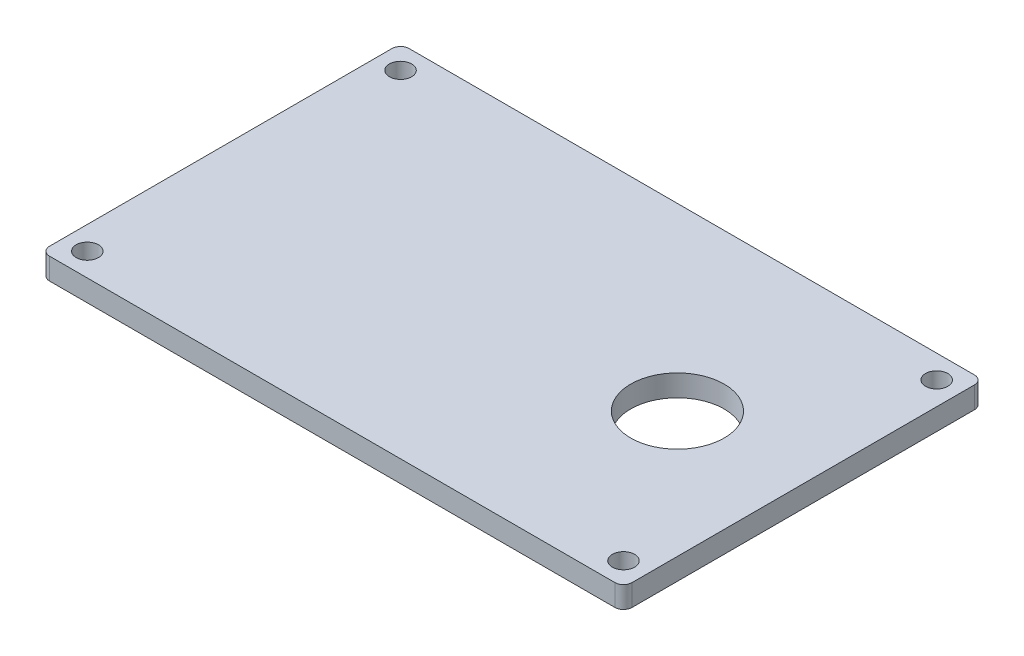
ISO-10303-21;
HEADER;
FILE_DESCRIPTION(('STEP AP214'),'2;1');
FILE_NAME('part.step','',(''),(''),'','','');
FILE_SCHEMA(('AUTOMOTIVE_DESIGN { 1 0 10303 214 1 1 1 1 }'));
ENDSEC;
DATA;
#1=APPLICATION_CONTEXT('core data for automotive mechanical design processes');
#2=APPLICATION_PROTOCOL_DEFINITION('international standard','automotive_design',2000,#1);
#3=PRODUCT_CONTEXT('',#1,'mechanical');
#4=PRODUCT('Part','Part','',(#3));
#5=PRODUCT_RELATED_PRODUCT_CATEGORY('part','',(#4));
#6=PRODUCT_DEFINITION_FORMATION('','',#4);
#7=PRODUCT_DEFINITION_CONTEXT('part definition',#1,'design');
#8=PRODUCT_DEFINITION('design','',#6,#7);
#9=PRODUCT_DEFINITION_SHAPE('','',#8);
#10=(LENGTH_UNIT() NAMED_UNIT(*) SI_UNIT(.MILLI.,.METRE.));
#11=(NAMED_UNIT(*) PLANE_ANGLE_UNIT() SI_UNIT($,.RADIAN.));
#12=(NAMED_UNIT(*) SI_UNIT($,.STERADIAN.) SOLID_ANGLE_UNIT());
#13=UNCERTAINTY_MEASURE_WITH_UNIT(LENGTH_MEASURE(1.E-05),#10,'distance_accuracy_value','');
#14=(GEOMETRIC_REPRESENTATION_CONTEXT(3) GLOBAL_UNCERTAINTY_ASSIGNED_CONTEXT((#13)) GLOBAL_UNIT_ASSIGNED_CONTEXT((#10,
#11,#12)) REPRESENTATION_CONTEXT('',''));
#15=CARTESIAN_POINT('',(0.,0.,0.));
#16=DIRECTION('',(0.,0.,1.));
#17=DIRECTION('',(1.,0.,0.));
#18=AXIS2_PLACEMENT_3D('',#15,#16,#17);
#19=CARTESIAN_POINT('',(-39.3,3.,23.8));
#20=DIRECTION('',(0.,-1.,0.));
#21=DIRECTION('',(0.,0.,-1.));
#22=AXIS2_PLACEMENT_3D('',#19,#20,#21);
#23=PLANE('',#22);
#24=CARTESIAN_POINT('',(23.,3.,0.));
#25=DIRECTION('',(0.,-1.,0.));
#26=DIRECTION('',(0.,0.,-1.));
#27=AXIS2_PLACEMENT_3D('',#24,#25,#26);
#28=CIRCLE('',#27,6.5);
#29=CARTESIAN_POINT('',(23.,3.,-6.5));
#30=VERTEX_POINT('',#29);
#31=EDGE_CURVE('E200',#30,#30,#28,.T.);
#32=ORIENTED_EDGE('',*,*,#31,.T.);
#33=EDGE_LOOP('',(#32));
#34=FACE_BOUND('',#33,.T.);
#35=CARTESIAN_POINT('',(-39.3,3.,23.8));
#36=DIRECTION('',(0.,1.,0.));
#37=DIRECTION('',(0.,0.,-1.));
#38=AXIS2_PLACEMENT_3D('',#35,#36,#37);
#39=CIRCLE('',#38,1.2);
#40=CARTESIAN_POINT('',(-40.5,3.,23.8));
#41=VERTEX_POINT('',#40);
#42=CARTESIAN_POINT('',(-39.3,3.,25.));
#43=VERTEX_POINT('',#42);
#44=EDGE_CURVE('E145',#41,#43,#39,.T.);
#45=ORIENTED_EDGE('',*,*,#44,.T.);
#46=DIRECTION('',(1.,0.,0.));
#47=VECTOR('',#46,1.);
#48=CARTESIAN_POINT('',(-39.3,3.,25.));
#49=LINE('',#48,#47);
#50=CARTESIAN_POINT('',(39.3,3.,25.));
#51=VERTEX_POINT('',#50);
#52=EDGE_CURVE('E93',#43,#51,#49,.T.);
#53=ORIENTED_EDGE('',*,*,#52,.T.);
#54=CARTESIAN_POINT('',(39.3,3.,23.8));
#55=DIRECTION('',(0.,1.,0.));
#56=DIRECTION('',(0.,0.,1.));
#57=AXIS2_PLACEMENT_3D('',#54,#55,#56);
#58=CIRCLE('',#57,1.2);
#59=CARTESIAN_POINT('',(40.5,3.,23.8));
#60=VERTEX_POINT('',#59);
#61=EDGE_CURVE('E160',#51,#60,#58,.T.);
#62=ORIENTED_EDGE('',*,*,#61,.T.);
#63=DIRECTION('',(0.,0.,-1.));
#64=VECTOR('',#63,1.);
#65=CARTESIAN_POINT('',(40.5,3.,23.8));
#66=LINE('',#65,#64);
#67=CARTESIAN_POINT('',(40.5,3.,-23.8));
#68=VERTEX_POINT('',#67);
#69=EDGE_CURVE('E173',#60,#68,#66,.T.);
#70=ORIENTED_EDGE('',*,*,#69,.T.);
#71=CARTESIAN_POINT('',(39.3,3.,-23.8));
#72=DIRECTION('',(0.,1.,0.));
#73=DIRECTION('',(0.,0.,-1.));
#74=AXIS2_PLACEMENT_3D('',#71,#72,#73);
#75=CIRCLE('',#74,1.2);
#76=CARTESIAN_POINT('',(39.3,3.,-25.));
#77=VERTEX_POINT('',#76);
#78=EDGE_CURVE('E112',#68,#77,#75,.T.);
#79=ORIENTED_EDGE('',*,*,#78,.T.);
#80=DIRECTION('',(-1.,0.,0.));
#81=VECTOR('',#80,1.);
#82=CARTESIAN_POINT('',(-39.3,3.,-25.));
#83=LINE('',#82,#81);
#84=CARTESIAN_POINT('',(-39.3,3.,-25.));
#85=VERTEX_POINT('',#84);
#86=EDGE_CURVE('E106',#77,#85,#83,.T.);
#87=ORIENTED_EDGE('',*,*,#86,.T.);
#88=CARTESIAN_POINT('',(-39.3,3.,-23.8));
#89=DIRECTION('',(0.,1.,0.));
#90=DIRECTION('',(0.,0.,-1.));
#91=AXIS2_PLACEMENT_3D('',#88,#89,#90);
#92=CIRCLE('',#91,1.2);
#93=CARTESIAN_POINT('',(-40.5,3.,-23.8));
#94=VERTEX_POINT('',#93);
#95=EDGE_CURVE('E110',#85,#94,#92,.T.);
#96=ORIENTED_EDGE('',*,*,#95,.T.);
#97=DIRECTION('',(0.,0.,1.));
#98=VECTOR('',#97,1.);
#99=CARTESIAN_POINT('',(-40.5,3.,23.8));
#100=LINE('',#99,#98);
#101=EDGE_CURVE('E50',#94,#41,#100,.T.);
#102=ORIENTED_EDGE('',*,*,#101,.T.);
#103=EDGE_LOOP('',(#45,#53,#62,#70,#79,#87,#96,#102));
#104=FACE_BOUND('',#103,.T.);
#105=CARTESIAN_POINT('',(-37.275,3.,-21.775));
#106=DIRECTION('',(0.,1.,0.));
#107=DIRECTION('',(0.,0.,1.));
#108=AXIS2_PLACEMENT_3D('',#105,#106,#107);
#109=CIRCLE('',#108,1.54999999999999);
#110=CARTESIAN_POINT('',(-37.275,3.,-20.225));
#111=VERTEX_POINT('',#110);
#112=EDGE_CURVE('E134',#111,#111,#109,.T.);
#113=ORIENTED_EDGE('',*,*,#112,.F.);
#114=EDGE_LOOP('',(#113));
#115=FACE_BOUND('',#114,.T.);
#116=CARTESIAN_POINT('',(37.275,3.,-21.775));
#117=DIRECTION('',(0.,1.,0.));
#118=DIRECTION('',(0.,0.,1.));
#119=AXIS2_PLACEMENT_3D('',#116,#117,#118);
#120=CIRCLE('',#119,1.54999999999999);
#121=CARTESIAN_POINT('',(37.275,3.,-20.225));
#122=VERTEX_POINT('',#121);
#123=EDGE_CURVE('E182',#122,#122,#120,.T.);
#124=ORIENTED_EDGE('',*,*,#123,.F.);
#125=EDGE_LOOP('',(#124));
#126=FACE_BOUND('',#125,.T.);
#127=CARTESIAN_POINT('',(37.275,3.,21.775));
#128=DIRECTION('',(0.,1.,0.));
#129=DIRECTION('',(0.,0.,1.));
#130=AXIS2_PLACEMENT_3D('',#127,#128,#129);
#131=CIRCLE('',#130,1.54999999999999);
#132=CARTESIAN_POINT('',(37.275,3.,23.325));
#133=VERTEX_POINT('',#132);
#134=EDGE_CURVE('E188',#133,#133,#131,.T.);
#135=ORIENTED_EDGE('',*,*,#134,.F.);
#136=EDGE_LOOP('',(#135));
#137=FACE_BOUND('',#136,.T.);
#138=CARTESIAN_POINT('',(-37.275,3.,21.775));
#139=DIRECTION('',(0.,1.,0.));
#140=DIRECTION('',(0.,0.,1.));
#141=AXIS2_PLACEMENT_3D('',#138,#139,#140);
#142=CIRCLE('',#141,1.54999999999999);
#143=CARTESIAN_POINT('',(-37.275,3.,23.325));
#144=VERTEX_POINT('',#143);
#145=EDGE_CURVE('E194',#144,#144,#142,.T.);
#146=ORIENTED_EDGE('',*,*,#145,.F.);
#147=EDGE_LOOP('',(#146));
#148=FACE_BOUND('',#147,.T.);
#149=ADVANCED_FACE('F33',(#34,#104,#115,#126,#137,#148),#23,.F.);
#150=CARTESIAN_POINT('',(-39.3,0.,23.8));
#151=DIRECTION('',(0.,-1.,0.));
#152=DIRECTION('',(0.,0.,-1.));
#153=AXIS2_PLACEMENT_3D('',#150,#151,#152);
#154=PLANE('',#153);
#155=CARTESIAN_POINT('',(23.,0.,0.));
#156=DIRECTION('',(0.,-1.,0.));
#157=DIRECTION('',(0.,0.,-1.));
#158=AXIS2_PLACEMENT_3D('',#155,#156,#157);
#159=CIRCLE('',#158,6.5);
#160=CARTESIAN_POINT('',(23.,0.,-6.5));
#161=VERTEX_POINT('',#160);
#162=EDGE_CURVE('E203',#161,#161,#159,.T.);
#163=ORIENTED_EDGE('',*,*,#162,.F.);
#164=EDGE_LOOP('',(#163));
#165=FACE_BOUND('',#164,.T.);
#166=CARTESIAN_POINT('',(37.275,0.,21.775));
#167=DIRECTION('',(0.,1.,0.));
#168=DIRECTION('',(0.,0.,1.));
#169=AXIS2_PLACEMENT_3D('',#166,#167,#168);
#170=CIRCLE('',#169,1.54999999999999);
#171=CARTESIAN_POINT('',(37.275,0.,23.325));
#172=VERTEX_POINT('',#171);
#173=EDGE_CURVE('E191',#172,#172,#170,.T.);
#174=ORIENTED_EDGE('',*,*,#173,.T.);
#175=EDGE_LOOP('',(#174));
#176=FACE_BOUND('',#175,.T.);
#177=CARTESIAN_POINT('',(-37.275,0.,-21.775));
#178=DIRECTION('',(0.,1.,0.));
#179=DIRECTION('',(0.,0.,1.));
#180=AXIS2_PLACEMENT_3D('',#177,#178,#179);
#181=CIRCLE('',#180,1.54999999999999);
#182=CARTESIAN_POINT('',(-37.275,0.,-20.225));
#183=VERTEX_POINT('',#182);
#184=EDGE_CURVE('E179',#183,#183,#181,.T.);
#185=ORIENTED_EDGE('',*,*,#184,.T.);
#186=EDGE_LOOP('',(#185));
#187=FACE_BOUND('',#186,.T.);
#188=CARTESIAN_POINT('',(-39.3,0.,23.8));
#189=DIRECTION('',(0.,1.,0.));
#190=DIRECTION('',(0.,0.,-1.));
#191=AXIS2_PLACEMENT_3D('',#188,#189,#190);
#192=CIRCLE('',#191,1.2);
#193=CARTESIAN_POINT('',(-40.5,0.,23.8));
#194=VERTEX_POINT('',#193);
#195=CARTESIAN_POINT('',(-39.3,0.,25.));
#196=VERTEX_POINT('',#195);
#197=EDGE_CURVE('E130',#194,#196,#192,.T.);
#198=ORIENTED_EDGE('',*,*,#197,.F.);
#199=DIRECTION('',(0.,0.,1.));
#200=VECTOR('',#199,1.);
#201=CARTESIAN_POINT('',(-40.5,0.,23.8));
#202=LINE('',#201,#200);
#203=CARTESIAN_POINT('',(-40.5,0.,-23.8));
#204=VERTEX_POINT('',#203);
#205=EDGE_CURVE('E85',#204,#194,#202,.T.);
#206=ORIENTED_EDGE('',*,*,#205,.F.);
#207=CARTESIAN_POINT('',(-39.3,0.,-23.8));
#208=DIRECTION('',(0.,1.,0.));
#209=DIRECTION('',(0.,0.,-1.));
#210=AXIS2_PLACEMENT_3D('',#207,#208,#209);
#211=CIRCLE('',#210,1.2);
#212=CARTESIAN_POINT('',(-39.3,0.,-25.));
#213=VERTEX_POINT('',#212);
#214=EDGE_CURVE('E79',#213,#204,#211,.T.);
#215=ORIENTED_EDGE('',*,*,#214,.F.);
#216=DIRECTION('',(-1.,0.,0.));
#217=VECTOR('',#216,1.);
#218=CARTESIAN_POINT('',(-39.3,0.,-25.));
#219=LINE('',#218,#217);
#220=CARTESIAN_POINT('',(39.3,0.,-25.));
#221=VERTEX_POINT('',#220);
#222=EDGE_CURVE('E120',#221,#213,#219,.T.);
#223=ORIENTED_EDGE('',*,*,#222,.F.);
#224=CARTESIAN_POINT('',(39.3,0.,-23.8));
#225=DIRECTION('',(0.,1.,0.));
#226=DIRECTION('',(0.,0.,-1.));
#227=AXIS2_PLACEMENT_3D('',#224,#225,#226);
#228=CIRCLE('',#227,1.2);
#229=CARTESIAN_POINT('',(40.5,0.,-23.8));
#230=VERTEX_POINT('',#229);
#231=EDGE_CURVE('E140',#230,#221,#228,.T.);
#232=ORIENTED_EDGE('',*,*,#231,.F.);
#233=DIRECTION('',(0.,0.,-1.));
#234=VECTOR('',#233,1.);
#235=CARTESIAN_POINT('',(40.5,0.,23.8));
#236=LINE('',#235,#234);
#237=CARTESIAN_POINT('',(40.5,0.,23.8));
#238=VERTEX_POINT('',#237);
#239=EDGE_CURVE('E138',#238,#230,#236,.T.);
#240=ORIENTED_EDGE('',*,*,#239,.F.);
#241=CARTESIAN_POINT('',(39.3,0.,23.8));
#242=DIRECTION('',(0.,1.,0.));
#243=DIRECTION('',(0.,0.,1.));
#244=AXIS2_PLACEMENT_3D('',#241,#242,#243);
#245=CIRCLE('',#244,1.2);
#246=CARTESIAN_POINT('',(39.3,0.,25.));
#247=VERTEX_POINT('',#246);
#248=EDGE_CURVE('E136',#247,#238,#245,.T.);
#249=ORIENTED_EDGE('',*,*,#248,.F.);
#250=DIRECTION('',(1.,0.,0.));
#251=VECTOR('',#250,1.);
#252=CARTESIAN_POINT('',(-39.3,0.,25.));
#253=LINE('',#252,#251);
#254=EDGE_CURVE('E133',#196,#247,#253,.T.);
#255=ORIENTED_EDGE('',*,*,#254,.F.);
#256=EDGE_LOOP('',(#198,#206,#215,#223,#232,#240,#249,#255));
#257=FACE_BOUND('',#256,.T.);
#258=CARTESIAN_POINT('',(37.275,0.,-21.775));
#259=DIRECTION('',(0.,1.,0.));
#260=DIRECTION('',(0.,0.,1.));
#261=AXIS2_PLACEMENT_3D('',#258,#259,#260);
#262=CIRCLE('',#261,1.54999999999999);
#263=CARTESIAN_POINT('',(37.275,0.,-20.225));
#264=VERTEX_POINT('',#263);
#265=EDGE_CURVE('E185',#264,#264,#262,.T.);
#266=ORIENTED_EDGE('',*,*,#265,.T.);
#267=EDGE_LOOP('',(#266));
#268=FACE_BOUND('',#267,.T.);
#269=CARTESIAN_POINT('',(-37.275,0.,21.775));
#270=DIRECTION('',(0.,1.,0.));
#271=DIRECTION('',(0.,0.,1.));
#272=AXIS2_PLACEMENT_3D('',#269,#270,#271);
#273=CIRCLE('',#272,1.54999999999999);
#274=CARTESIAN_POINT('',(-37.275,0.,23.325));
#275=VERTEX_POINT('',#274);
#276=EDGE_CURVE('E197',#275,#275,#273,.T.);
#277=ORIENTED_EDGE('',*,*,#276,.T.);
#278=EDGE_LOOP('',(#277));
#279=FACE_BOUND('',#278,.T.);
#280=ADVANCED_FACE('F164',(#165,#176,#187,#257,#268,#279),#154,.T.);
#281=CARTESIAN_POINT('',(-39.3,3.,23.8));
#282=DIRECTION('',(0.,-1.,0.));
#283=DIRECTION('',(0.,0.,-1.));
#284=AXIS2_PLACEMENT_3D('',#281,#282,#283);
#285=CYLINDRICAL_SURFACE('',#284,1.2);
#286=ORIENTED_EDGE('',*,*,#197,.T.);
#287=DIRECTION('',(0.,-1.,0.));
#288=VECTOR('',#287,1.);
#289=CARTESIAN_POINT('',(-39.3,3.,25.));
#290=LINE('',#289,#288);
#291=EDGE_CURVE('E11',#43,#196,#290,.T.);
#292=ORIENTED_EDGE('',*,*,#291,.F.);
#293=ORIENTED_EDGE('',*,*,#44,.F.);
#294=DIRECTION('',(0.,-1.,0.));
#295=VECTOR('',#294,1.);
#296=CARTESIAN_POINT('',(-40.5,3.,23.8));
#297=LINE('',#296,#295);
#298=EDGE_CURVE('E126',#41,#194,#297,.T.);
#299=ORIENTED_EDGE('',*,*,#298,.T.);
#300=EDGE_LOOP('',(#286,#292,#293,#299));
#301=FACE_BOUND('',#300,.T.);
#302=ADVANCED_FACE('F35',(#301),#285,.T.);
#303=CARTESIAN_POINT('',(-39.3,3.,25.));
#304=DIRECTION('',(0.,0.,-1.));
#305=DIRECTION('',(-1.,0.,0.));
#306=AXIS2_PLACEMENT_3D('',#303,#304,#305);
#307=PLANE('',#306);
#308=ORIENTED_EDGE('',*,*,#254,.T.);
#309=DIRECTION('',(0.,-1.,0.));
#310=VECTOR('',#309,1.);
#311=CARTESIAN_POINT('',(39.3,3.,25.));
#312=LINE('',#311,#310);
#313=EDGE_CURVE('E42',#51,#247,#312,.T.);
#314=ORIENTED_EDGE('',*,*,#313,.F.);
#315=ORIENTED_EDGE('',*,*,#52,.F.);
#316=ORIENTED_EDGE('',*,*,#291,.T.);
#317=EDGE_LOOP('',(#308,#314,#315,#316));
#318=FACE_BOUND('',#317,.T.);
#319=ADVANCED_FACE('F252',(#318),#307,.F.);
#320=CARTESIAN_POINT('',(39.3,3.,23.8));
#321=DIRECTION('',(0.,-1.,0.));
#322=DIRECTION('',(0.,0.,-1.));
#323=AXIS2_PLACEMENT_3D('',#320,#321,#322);
#324=CYLINDRICAL_SURFACE('',#323,1.2);
#325=ORIENTED_EDGE('',*,*,#248,.T.);
#326=DIRECTION('',(0.,-1.,0.));
#327=VECTOR('',#326,1.);
#328=CARTESIAN_POINT('',(40.5,3.,23.8));
#329=LINE('',#328,#327);
#330=EDGE_CURVE('E152',#60,#238,#329,.T.);
#331=ORIENTED_EDGE('',*,*,#330,.F.);
#332=ORIENTED_EDGE('',*,*,#61,.F.);
#333=ORIENTED_EDGE('',*,*,#313,.T.);
#334=EDGE_LOOP('',(#325,#331,#332,#333));
#335=FACE_BOUND('',#334,.T.);
#336=ADVANCED_FACE('F158',(#335),#324,.T.);
#337=CARTESIAN_POINT('',(40.5,3.,23.8));
#338=DIRECTION('',(-1.,0.,0.));
#339=DIRECTION('',(0.,0.,1.));
#340=AXIS2_PLACEMENT_3D('',#337,#338,#339);
#341=PLANE('',#340);
#342=ORIENTED_EDGE('',*,*,#239,.T.);
#343=DIRECTION('',(0.,-1.,0.));
#344=VECTOR('',#343,1.);
#345=CARTESIAN_POINT('',(40.5,3.,-23.8));
#346=LINE('',#345,#344);
#347=EDGE_CURVE('E149',#68,#230,#346,.T.);
#348=ORIENTED_EDGE('',*,*,#347,.F.);
#349=ORIENTED_EDGE('',*,*,#69,.F.);
#350=ORIENTED_EDGE('',*,*,#330,.T.);
#351=EDGE_LOOP('',(#342,#348,#349,#350));
#352=FACE_BOUND('',#351,.T.);
#353=ADVANCED_FACE('F169',(#352),#341,.F.);
#354=CARTESIAN_POINT('',(39.3,3.,-23.8));
#355=DIRECTION('',(0.,-1.,0.));
#356=DIRECTION('',(0.,0.,-1.));
#357=AXIS2_PLACEMENT_3D('',#354,#355,#356);
#358=CYLINDRICAL_SURFACE('',#357,1.2);
#359=ORIENTED_EDGE('',*,*,#231,.T.);
#360=DIRECTION('',(0.,-1.,0.));
#361=VECTOR('',#360,1.);
#362=CARTESIAN_POINT('',(39.3,3.,-25.));
#363=LINE('',#362,#361);
#364=EDGE_CURVE('E121',#77,#221,#363,.T.);
#365=ORIENTED_EDGE('',*,*,#364,.F.);
#366=ORIENTED_EDGE('',*,*,#78,.F.);
#367=ORIENTED_EDGE('',*,*,#347,.T.);
#368=EDGE_LOOP('',(#359,#365,#366,#367));
#369=FACE_BOUND('',#368,.T.);
#370=ADVANCED_FACE('F172',(#369),#358,.T.);
#371=CARTESIAN_POINT('',(-39.3,3.,-25.));
#372=DIRECTION('',(0.,0.,1.));
#373=DIRECTION('',(1.,0.,0.));
#374=AXIS2_PLACEMENT_3D('',#371,#372,#373);
#375=PLANE('',#374);
#376=ORIENTED_EDGE('',*,*,#222,.T.);
#377=DIRECTION('',(0.,-1.,0.));
#378=VECTOR('',#377,1.);
#379=CARTESIAN_POINT('',(-39.3,3.,-25.));
#380=LINE('',#379,#378);
#381=EDGE_CURVE('E117',#85,#213,#380,.T.);
#382=ORIENTED_EDGE('',*,*,#381,.F.);
#383=ORIENTED_EDGE('',*,*,#86,.F.);
#384=ORIENTED_EDGE('',*,*,#364,.T.);
#385=EDGE_LOOP('',(#376,#382,#383,#384));
#386=FACE_BOUND('',#385,.T.);
#387=ADVANCED_FACE('F118',(#386),#375,.F.);
#388=CARTESIAN_POINT('',(-39.3,3.,-23.8));
#389=DIRECTION('',(0.,-1.,0.));
#390=DIRECTION('',(0.,0.,-1.));
#391=AXIS2_PLACEMENT_3D('',#388,#389,#390);
#392=CYLINDRICAL_SURFACE('',#391,1.2);
#393=ORIENTED_EDGE('',*,*,#214,.T.);
#394=DIRECTION('',(0.,-1.,0.));
#395=VECTOR('',#394,1.);
#396=CARTESIAN_POINT('',(-40.5,3.,-23.8));
#397=LINE('',#396,#395);
#398=EDGE_CURVE('E122',#94,#204,#397,.T.);
#399=ORIENTED_EDGE('',*,*,#398,.F.);
#400=ORIENTED_EDGE('',*,*,#95,.F.);
#401=ORIENTED_EDGE('',*,*,#381,.T.);
#402=EDGE_LOOP('',(#393,#399,#400,#401));
#403=FACE_BOUND('',#402,.T.);
#404=ADVANCED_FACE('F124',(#403),#392,.T.);
#405=CARTESIAN_POINT('',(-40.5,3.,23.8));
#406=DIRECTION('',(1.,0.,0.));
#407=DIRECTION('',(0.,0.,-1.));
#408=AXIS2_PLACEMENT_3D('',#405,#406,#407);
#409=PLANE('',#408);
#410=ORIENTED_EDGE('',*,*,#205,.T.);
#411=ORIENTED_EDGE('',*,*,#298,.F.);
#412=ORIENTED_EDGE('',*,*,#101,.F.);
#413=ORIENTED_EDGE('',*,*,#398,.T.);
#414=EDGE_LOOP('',(#410,#411,#412,#413));
#415=FACE_BOUND('',#414,.T.);
#416=ADVANCED_FACE('F227',(#415),#409,.F.);
#417=CARTESIAN_POINT('',(-37.275,3.,-21.775));
#418=DIRECTION('',(0.,-1.,0.));
#419=DIRECTION('',(0.,0.,-1.));
#420=AXIS2_PLACEMENT_3D('',#417,#418,#419);
#421=CYLINDRICAL_SURFACE('',#420,1.54999999999999);
#422=ORIENTED_EDGE('',*,*,#112,.T.);
#423=EDGE_LOOP('',(#422));
#424=FACE_BOUND('',#423,.T.);
#425=ORIENTED_EDGE('',*,*,#184,.F.);
#426=EDGE_LOOP('',(#425));
#427=FACE_BOUND('',#426,.T.);
#428=ADVANCED_FACE('F224',(#424,#427),#421,.F.);
#429=CARTESIAN_POINT('',(37.275,3.,-21.775));
#430=DIRECTION('',(0.,-1.,0.));
#431=DIRECTION('',(0.,0.,-1.));
#432=AXIS2_PLACEMENT_3D('',#429,#430,#431);
#433=CYLINDRICAL_SURFACE('',#432,1.54999999999999);
#434=ORIENTED_EDGE('',*,*,#123,.T.);
#435=EDGE_LOOP('',(#434));
#436=FACE_BOUND('',#435,.T.);
#437=ORIENTED_EDGE('',*,*,#265,.F.);
#438=EDGE_LOOP('',(#437));
#439=FACE_BOUND('',#438,.T.);
#440=ADVANCED_FACE('F226',(#436,#439),#433,.F.);
#441=CARTESIAN_POINT('',(37.275,3.,21.775));
#442=DIRECTION('',(0.,-1.,0.));
#443=DIRECTION('',(0.,0.,-1.));
#444=AXIS2_PLACEMENT_3D('',#441,#442,#443);
#445=CYLINDRICAL_SURFACE('',#444,1.54999999999999);
#446=ORIENTED_EDGE('',*,*,#134,.T.);
#447=EDGE_LOOP('',(#446));
#448=FACE_BOUND('',#447,.T.);
#449=ORIENTED_EDGE('',*,*,#173,.F.);
#450=EDGE_LOOP('',(#449));
#451=FACE_BOUND('',#450,.T.);
#452=ADVANCED_FACE('F234',(#448,#451),#445,.F.);
#453=CARTESIAN_POINT('',(-37.275,3.,21.775));
#454=DIRECTION('',(0.,-1.,0.));
#455=DIRECTION('',(0.,0.,-1.));
#456=AXIS2_PLACEMENT_3D('',#453,#454,#455);
#457=CYLINDRICAL_SURFACE('',#456,1.54999999999999);
#458=ORIENTED_EDGE('',*,*,#145,.T.);
#459=EDGE_LOOP('',(#458));
#460=FACE_BOUND('',#459,.T.);
#461=ORIENTED_EDGE('',*,*,#276,.F.);
#462=EDGE_LOOP('',(#461));
#463=FACE_BOUND('',#462,.T.);
#464=ADVANCED_FACE('F213',(#460,#463),#457,.F.);
#465=CARTESIAN_POINT('',(23.,3.,0.));
#466=DIRECTION('',(0.,-1.,0.));
#467=DIRECTION('',(0.,0.,-1.));
#468=AXIS2_PLACEMENT_3D('',#465,#466,#467);
#469=CYLINDRICAL_SURFACE('',#468,6.5);
#470=ORIENTED_EDGE('',*,*,#31,.F.);
#471=EDGE_LOOP('',(#470));
#472=FACE_BOUND('',#471,.T.);
#473=ORIENTED_EDGE('',*,*,#162,.T.);
#474=EDGE_LOOP('',(#473));
#475=FACE_BOUND('',#474,.T.);
#476=ADVANCED_FACE('F210',(#472,#475),#469,.F.);
#477=CLOSED_SHELL('',(#149,#280,#302,#319,#336,#353,#370,#387,#404,#416,#428,#440,#452,#464,#476));
#478=MANIFOLD_SOLID_BREP('B2',#477);
#479=ADVANCED_BREP_SHAPE_REPRESENTATION('',(#18,#478),#14);
#480=SHAPE_DEFINITION_REPRESENTATION(#9,#479);
ENDSEC;
END-ISO-10303-21;
